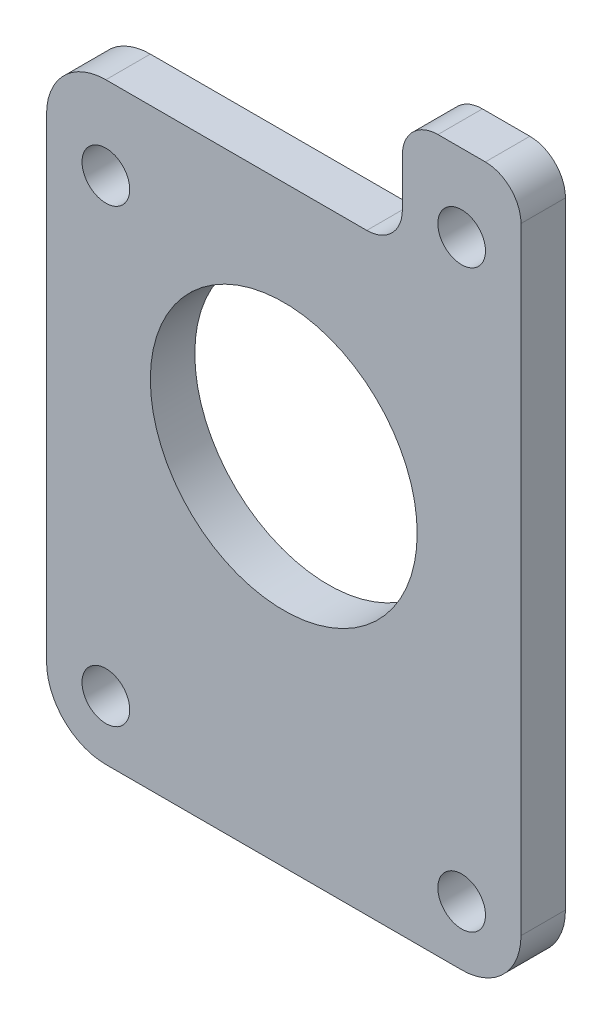
ISO-10303-21;
HEADER;
FILE_DESCRIPTION(('STEP AP214'),'2;1');
FILE_NAME('part.step','',(''),(''),'','','');
FILE_SCHEMA(('AUTOMOTIVE_DESIGN { 1 0 10303 214 1 1 1 1 }'));
ENDSEC;
DATA;
#1=APPLICATION_CONTEXT('core data for automotive mechanical design processes');
#2=APPLICATION_PROTOCOL_DEFINITION('international standard','automotive_design',2000,#1);
#3=PRODUCT_CONTEXT('',#1,'mechanical');
#4=PRODUCT('Part','Part','',(#3));
#5=PRODUCT_RELATED_PRODUCT_CATEGORY('part','',(#4));
#6=PRODUCT_DEFINITION_FORMATION('','',#4);
#7=PRODUCT_DEFINITION_CONTEXT('part definition',#1,'design');
#8=PRODUCT_DEFINITION('design','',#6,#7);
#9=PRODUCT_DEFINITION_SHAPE('','',#8);
#10=(LENGTH_UNIT() NAMED_UNIT(*) SI_UNIT(.MILLI.,.METRE.));
#11=(NAMED_UNIT(*) PLANE_ANGLE_UNIT() SI_UNIT($,.RADIAN.));
#12=(NAMED_UNIT(*) SI_UNIT($,.STERADIAN.) SOLID_ANGLE_UNIT());
#13=UNCERTAINTY_MEASURE_WITH_UNIT(LENGTH_MEASURE(1.E-05),#10,'distance_accuracy_value','');
#14=(GEOMETRIC_REPRESENTATION_CONTEXT(3) GLOBAL_UNCERTAINTY_ASSIGNED_CONTEXT((#13)) GLOBAL_UNIT_ASSIGNED_CONTEXT((#10,
#11,#12)) REPRESENTATION_CONTEXT('',''));
#15=CARTESIAN_POINT('',(0.,0.,0.));
#16=DIRECTION('',(0.,0.,1.));
#17=DIRECTION('',(1.,0.,0.));
#18=AXIS2_PLACEMENT_3D('',#15,#16,#17);
#19=CARTESIAN_POINT('',(50.8,0.,4.7625));
#20=DIRECTION('',(1.,0.,0.));
#21=DIRECTION('',(0.,0.,-1.));
#22=AXIS2_PLACEMENT_3D('',#19,#20,#21);
#23=PLANE('',#22);
#24=DIRECTION('',(0.,-1.,0.));
#25=VECTOR('',#24,1.);
#26=CARTESIAN_POINT('',(50.8,0.,0.));
#27=LINE('',#26,#25);
#28=CARTESIAN_POINT('',(50.8,72.39,0.));
#29=VERTEX_POINT('',#28);
#30=CARTESIAN_POINT('',(50.8,6.35,0.));
#31=VERTEX_POINT('',#30);
#32=EDGE_CURVE('E125',#29,#31,#27,.T.);
#33=ORIENTED_EDGE('',*,*,#32,.F.);
#34=DIRECTION('',(0.,0.,-1.));
#35=VECTOR('',#34,1.);
#36=CARTESIAN_POINT('',(50.8,72.39,4.7625));
#37=LINE('',#36,#35);
#38=CARTESIAN_POINT('',(50.8,72.39,4.7625));
#39=VERTEX_POINT('',#38);
#40=EDGE_CURVE('E189',#29,#39,#37,.F.);
#41=ORIENTED_EDGE('',*,*,#40,.T.);
#42=DIRECTION('',(0.,-1.,0.));
#43=VECTOR('',#42,1.);
#44=CARTESIAN_POINT('',(50.8,0.,4.7625));
#45=LINE('',#44,#43);
#46=CARTESIAN_POINT('',(50.8,6.35,4.7625));
#47=VERTEX_POINT('',#46);
#48=EDGE_CURVE('E151',#39,#47,#45,.T.);
#49=ORIENTED_EDGE('',*,*,#48,.T.);
#50=DIRECTION('',(0.,0.,-1.));
#51=VECTOR('',#50,1.);
#52=CARTESIAN_POINT('',(50.8,6.35,0.));
#53=LINE('',#52,#51);
#54=EDGE_CURVE('E145',#47,#31,#53,.T.);
#55=ORIENTED_EDGE('',*,*,#54,.T.);
#56=EDGE_LOOP('',(#33,#41,#49,#55));
#57=FACE_BOUND('',#56,.T.);
#58=ADVANCED_FACE('F37',(#57),#23,.T.);
#59=CARTESIAN_POINT('',(0.,76.2,4.7625));
#60=DIRECTION('',(0.,-1.,0.));
#61=DIRECTION('',(0.,0.,-1.));
#62=AXIS2_PLACEMENT_3D('',#59,#60,#61);
#63=PLANE('',#62);
#64=DIRECTION('',(-1.,0.,0.));
#65=VECTOR('',#64,1.);
#66=CARTESIAN_POINT('',(0.,76.2,4.7625));
#67=LINE('',#66,#65);
#68=CARTESIAN_POINT('',(46.99,76.2,4.7625));
#69=VERTEX_POINT('',#68);
#70=CARTESIAN_POINT('',(41.91,76.2,4.7625));
#71=VERTEX_POINT('',#70);
#72=EDGE_CURVE('E224',#69,#71,#67,.T.);
#73=ORIENTED_EDGE('',*,*,#72,.F.);
#74=DIRECTION('',(0.,0.,-1.));
#75=VECTOR('',#74,1.);
#76=CARTESIAN_POINT('',(46.99,76.2,0.));
#77=LINE('',#76,#75);
#78=CARTESIAN_POINT('',(46.99,76.2,0.));
#79=VERTEX_POINT('',#78);
#80=EDGE_CURVE('E183',#69,#79,#77,.T.);
#81=ORIENTED_EDGE('',*,*,#80,.T.);
#82=DIRECTION('',(-1.,0.,0.));
#83=VECTOR('',#82,1.);
#84=CARTESIAN_POINT('',(0.,76.2,0.));
#85=LINE('',#84,#83);
#86=CARTESIAN_POINT('',(41.91,76.2,0.));
#87=VERTEX_POINT('',#86);
#88=EDGE_CURVE('E137',#79,#87,#85,.T.);
#89=ORIENTED_EDGE('',*,*,#88,.T.);
#90=DIRECTION('',(0.,0.,-1.));
#91=VECTOR('',#90,1.);
#92=CARTESIAN_POINT('',(41.91,76.2,4.7625));
#93=LINE('',#92,#91);
#94=EDGE_CURVE('E181',#87,#71,#93,.F.);
#95=ORIENTED_EDGE('',*,*,#94,.T.);
#96=EDGE_LOOP('',(#73,#81,#89,#95));
#97=FACE_BOUND('',#96,.T.);
#98=ADVANCED_FACE('F274',(#97),#63,.F.);
#99=CARTESIAN_POINT('',(38.1,0.,4.7625));
#100=DIRECTION('',(-1.,0.,0.));
#101=DIRECTION('',(0.,0.,1.));
#102=AXIS2_PLACEMENT_3D('',#99,#100,#101);
#103=PLANE('',#102);
#104=DIRECTION('',(0.,1.,0.));
#105=VECTOR('',#104,1.);
#106=CARTESIAN_POINT('',(38.1,0.,4.7625));
#107=LINE('',#106,#105);
#108=CARTESIAN_POINT('',(38.1,67.31,4.7625));
#109=VERTEX_POINT('',#108);
#110=CARTESIAN_POINT('',(38.1,72.39,4.7625));
#111=VERTEX_POINT('',#110);
#112=EDGE_CURVE('E220',#109,#111,#107,.T.);
#113=ORIENTED_EDGE('',*,*,#112,.T.);
#114=DIRECTION('',(0.,0.,-1.));
#115=VECTOR('',#114,1.);
#116=CARTESIAN_POINT('',(38.1,72.39,0.));
#117=LINE('',#116,#115);
#118=CARTESIAN_POINT('',(38.1,72.39,0.));
#119=VERTEX_POINT('',#118);
#120=EDGE_CURVE('E196',#111,#119,#117,.T.);
#121=ORIENTED_EDGE('',*,*,#120,.T.);
#122=DIRECTION('',(0.,1.,0.));
#123=VECTOR('',#122,1.);
#124=CARTESIAN_POINT('',(38.1,0.,0.));
#125=LINE('',#124,#123);
#126=CARTESIAN_POINT('',(38.1,67.31,0.));
#127=VERTEX_POINT('',#126);
#128=EDGE_CURVE('E204',#127,#119,#125,.T.);
#129=ORIENTED_EDGE('',*,*,#128,.F.);
#130=DIRECTION('',(0.,0.,-1.));
#131=VECTOR('',#130,1.);
#132=CARTESIAN_POINT('',(38.1,67.31,4.7625));
#133=LINE('',#132,#131);
#134=EDGE_CURVE('E194',#127,#109,#133,.F.);
#135=ORIENTED_EDGE('',*,*,#134,.T.);
#136=EDGE_LOOP('',(#113,#121,#129,#135));
#137=FACE_BOUND('',#136,.T.);
#138=ADVANCED_FACE('F211',(#137),#103,.T.);
#139=CARTESIAN_POINT('',(0.,63.5,4.7625));
#140=DIRECTION('',(0.,1.,0.));
#141=DIRECTION('',(0.,0.,1.));
#142=AXIS2_PLACEMENT_3D('',#139,#140,#141);
#143=PLANE('',#142);
#144=DIRECTION('',(1.,0.,0.));
#145=VECTOR('',#144,1.);
#146=CARTESIAN_POINT('',(0.,63.5,4.7625));
#147=LINE('',#146,#145);
#148=CARTESIAN_POINT('',(6.34999999999999,63.5,4.7625));
#149=VERTEX_POINT('',#148);
#150=CARTESIAN_POINT('',(34.29,63.5,4.7625));
#151=VERTEX_POINT('',#150);
#152=EDGE_CURVE('E217',#149,#151,#147,.T.);
#153=ORIENTED_EDGE('',*,*,#152,.T.);
#154=DIRECTION('',(0.,0.,-1.));
#155=VECTOR('',#154,1.);
#156=CARTESIAN_POINT('',(34.29,63.5,0.));
#157=LINE('',#156,#155);
#158=CARTESIAN_POINT('',(34.29,63.5,0.));
#159=VERTEX_POINT('',#158);
#160=EDGE_CURVE('E199',#151,#159,#157,.T.);
#161=ORIENTED_EDGE('',*,*,#160,.T.);
#162=DIRECTION('',(1.,0.,0.));
#163=VECTOR('',#162,1.);
#164=CARTESIAN_POINT('',(0.,63.5,0.));
#165=LINE('',#164,#163);
#166=CARTESIAN_POINT('',(6.34999999999999,63.5,0.));
#167=VERTEX_POINT('',#166);
#168=EDGE_CURVE('E206',#167,#159,#165,.T.);
#169=ORIENTED_EDGE('',*,*,#168,.F.);
#170=DIRECTION('',(0.,0.,-1.));
#171=VECTOR('',#170,1.);
#172=CARTESIAN_POINT('',(6.34999999999999,63.5,4.7625));
#173=LINE('',#172,#171);
#174=EDGE_CURVE('E179',#167,#149,#173,.F.);
#175=ORIENTED_EDGE('',*,*,#174,.T.);
#176=EDGE_LOOP('',(#153,#161,#169,#175));
#177=FACE_BOUND('',#176,.T.);
#178=ADVANCED_FACE('F215',(#177),#143,.T.);
#179=CARTESIAN_POINT('',(0.,0.,4.7625));
#180=DIRECTION('',(1.,0.,0.));
#181=DIRECTION('',(0.,1.,0.));
#182=AXIS2_PLACEMENT_3D('',#179,#180,#181);
#183=PLANE('',#182);
#184=DIRECTION('',(0.,-1.,0.));
#185=VECTOR('',#184,1.);
#186=CARTESIAN_POINT('',(0.,0.,0.));
#187=LINE('',#186,#185);
#188=CARTESIAN_POINT('',(0.,57.15,0.));
#189=VERTEX_POINT('',#188);
#190=CARTESIAN_POINT('',(0.,6.35,0.));
#191=VERTEX_POINT('',#190);
#192=EDGE_CURVE('E244',#189,#191,#187,.T.);
#193=ORIENTED_EDGE('',*,*,#192,.T.);
#194=DIRECTION('',(0.,0.,-1.));
#195=VECTOR('',#194,1.);
#196=CARTESIAN_POINT('',(0.,6.35,4.7625));
#197=LINE('',#196,#195);
#198=CARTESIAN_POINT('',(0.,6.35,4.7625));
#199=VERTEX_POINT('',#198);
#200=EDGE_CURVE('E177',#191,#199,#197,.F.);
#201=ORIENTED_EDGE('',*,*,#200,.T.);
#202=DIRECTION('',(0.,-1.,0.));
#203=VECTOR('',#202,1.);
#204=CARTESIAN_POINT('',(0.,0.,4.7625));
#205=LINE('',#204,#203);
#206=CARTESIAN_POINT('',(0.,57.15,4.7625));
#207=VERTEX_POINT('',#206);
#208=EDGE_CURVE('E219',#207,#199,#205,.T.);
#209=ORIENTED_EDGE('',*,*,#208,.F.);
#210=DIRECTION('',(0.,0.,-1.));
#211=VECTOR('',#210,1.);
#212=CARTESIAN_POINT('',(0.,57.15,0.));
#213=LINE('',#212,#211);
#214=EDGE_CURVE('E174',#207,#189,#213,.T.);
#215=ORIENTED_EDGE('',*,*,#214,.T.);
#216=EDGE_LOOP('',(#193,#201,#209,#215));
#217=FACE_BOUND('',#216,.T.);
#218=ADVANCED_FACE('F286',(#217),#183,.F.);
#219=CARTESIAN_POINT('',(0.,0.,4.7625));
#220=DIRECTION('',(0.,1.,0.));
#221=DIRECTION('',(0.,0.,1.));
#222=AXIS2_PLACEMENT_3D('',#219,#220,#221);
#223=PLANE('',#222);
#224=DIRECTION('',(1.,0.,0.));
#225=VECTOR('',#224,1.);
#226=CARTESIAN_POINT('',(0.,0.,0.));
#227=LINE('',#226,#225);
#228=CARTESIAN_POINT('',(6.35,0.,0.));
#229=VERTEX_POINT('',#228);
#230=CARTESIAN_POINT('',(44.45,0.,0.));
#231=VERTEX_POINT('',#230);
#232=EDGE_CURVE('E246',#229,#231,#227,.T.);
#233=ORIENTED_EDGE('',*,*,#232,.T.);
#234=DIRECTION('',(0.,0.,-1.));
#235=VECTOR('',#234,1.);
#236=CARTESIAN_POINT('',(44.45,0.,4.7625));
#237=LINE('',#236,#235);
#238=CARTESIAN_POINT('',(44.45,0.,4.7625));
#239=VERTEX_POINT('',#238);
#240=EDGE_CURVE('E146',#231,#239,#237,.F.);
#241=ORIENTED_EDGE('',*,*,#240,.T.);
#242=DIRECTION('',(1.,0.,0.));
#243=VECTOR('',#242,1.);
#244=CARTESIAN_POINT('',(0.,0.,4.7625));
#245=LINE('',#244,#243);
#246=CARTESIAN_POINT('',(6.35,0.,4.7625));
#247=VERTEX_POINT('',#246);
#248=EDGE_CURVE('E158',#247,#239,#245,.T.);
#249=ORIENTED_EDGE('',*,*,#248,.F.);
#250=DIRECTION('',(0.,0.,-1.));
#251=VECTOR('',#250,1.);
#252=CARTESIAN_POINT('',(6.35,0.,4.7625));
#253=LINE('',#252,#251);
#254=EDGE_CURVE('E147',#247,#229,#253,.T.);
#255=ORIENTED_EDGE('',*,*,#254,.T.);
#256=EDGE_LOOP('',(#233,#241,#249,#255));
#257=FACE_BOUND('',#256,.T.);
#258=ADVANCED_FACE('F280',(#257),#223,.F.);
#259=CARTESIAN_POINT('',(6.35,6.35000000000001,4.7625));
#260=DIRECTION('',(0.,0.,-1.));
#261=DIRECTION('',(-1.,0.,0.));
#262=AXIS2_PLACEMENT_3D('',#259,#260,#261);
#263=CYLINDRICAL_SURFACE('',#262,2.5527);
#264=CARTESIAN_POINT('',(6.35,6.35000000000001,4.7625));
#265=DIRECTION('',(0.,0.,1.));
#266=DIRECTION('',(1.,0.,0.));
#267=AXIS2_PLACEMENT_3D('',#264,#265,#266);
#268=CIRCLE('',#267,2.5527);
#269=CARTESIAN_POINT('',(3.7973,6.35000000000001,4.7625));
#270=VERTEX_POINT('',#269);
#271=EDGE_CURVE('E262',#270,#270,#268,.T.);
#272=CARTESIAN_POINT('',(6.35,6.35000000000001,0.));
#273=DIRECTION('',(0.,0.,1.));
#274=DIRECTION('',(1.,0.,0.));
#275=AXIS2_PLACEMENT_3D('',#272,#273,#274);
#276=CIRCLE('',#275,2.5527);
#277=CARTESIAN_POINT('',(3.7973,6.35000000000001,0.));
#278=VERTEX_POINT('',#277);
#279=EDGE_CURVE('E138',#278,#278,#276,.T.);
#280=CARTESIAN_POINT('',(3.7973,6.35000000000001,4.7625));
#281=CARTESIAN_POINT('',(3.7973,6.35000000000001,4.712890625));
#282=CARTESIAN_POINT('',(3.7973,6.35000000000001,4.66328125));
#283=CARTESIAN_POINT('',(3.7973,6.35000000000001,4.5640625));
#284=CARTESIAN_POINT('',(3.7973,6.35000000000001,4.514453125));
#285=CARTESIAN_POINT('',(3.7973,6.35000000000001,4.415234375));
#286=CARTESIAN_POINT('',(3.7973,6.35000000000001,4.365625));
#287=CARTESIAN_POINT('',(3.7973,6.35000000000001,4.26640625));
#288=CARTESIAN_POINT('',(3.7973,6.35000000000001,4.216796875));
#289=CARTESIAN_POINT('',(3.7973,6.35000000000001,4.117578125));
#290=CARTESIAN_POINT('',(3.7973,6.35000000000001,4.06796875));
#291=CARTESIAN_POINT('',(3.7973,6.35000000000001,3.96875));
#292=CARTESIAN_POINT('',(3.7973,6.35000000000001,3.919140625));
#293=CARTESIAN_POINT('',(3.7973,6.35000000000001,3.819921875));
#294=CARTESIAN_POINT('',(3.7973,6.35000000000001,3.7703125));
#295=CARTESIAN_POINT('',(3.7973,6.35000000000001,3.67109375));
#296=CARTESIAN_POINT('',(3.7973,6.35000000000001,3.621484375));
#297=CARTESIAN_POINT('',(3.7973,6.35000000000001,3.522265625));
#298=CARTESIAN_POINT('',(3.7973,6.35000000000001,3.47265625));
#299=CARTESIAN_POINT('',(3.7973,6.35000000000001,3.3734375));
#300=CARTESIAN_POINT('',(3.7973,6.35000000000001,3.323828125));
#301=CARTESIAN_POINT('',(3.7973,6.35000000000001,3.224609375));
#302=CARTESIAN_POINT('',(3.7973,6.35000000000001,3.175));
#303=CARTESIAN_POINT('',(3.7973,6.35000000000001,3.07578125));
#304=CARTESIAN_POINT('',(3.7973,6.35000000000001,3.026171875));
#305=CARTESIAN_POINT('',(3.7973,6.35000000000001,2.926953125));
#306=CARTESIAN_POINT('',(3.7973,6.35000000000001,2.87734375));
#307=CARTESIAN_POINT('',(3.7973,6.35000000000001,2.778125));
#308=CARTESIAN_POINT('',(3.7973,6.35000000000001,2.728515625));
#309=CARTESIAN_POINT('',(3.7973,6.35000000000001,2.629296875));
#310=CARTESIAN_POINT('',(3.7973,6.35000000000001,2.5796875));
#311=CARTESIAN_POINT('',(3.7973,6.35000000000001,2.48046875));
#312=CARTESIAN_POINT('',(3.7973,6.35000000000001,2.430859375));
#313=CARTESIAN_POINT('',(3.7973,6.35000000000001,2.331640625));
#314=CARTESIAN_POINT('',(3.7973,6.35000000000001,2.28203125));
#315=CARTESIAN_POINT('',(3.7973,6.35000000000001,2.1828125));
#316=CARTESIAN_POINT('',(3.7973,6.35000000000001,2.133203125));
#317=CARTESIAN_POINT('',(3.7973,6.35000000000001,2.033984375));
#318=CARTESIAN_POINT('',(3.7973,6.35000000000001,1.984375));
#319=CARTESIAN_POINT('',(3.7973,6.35000000000001,1.88515625));
#320=CARTESIAN_POINT('',(3.7973,6.35000000000001,1.835546875));
#321=CARTESIAN_POINT('',(3.7973,6.35000000000001,1.736328125));
#322=CARTESIAN_POINT('',(3.7973,6.35000000000001,1.68671875));
#323=CARTESIAN_POINT('',(3.7973,6.35000000000001,1.5875));
#324=CARTESIAN_POINT('',(3.7973,6.35000000000001,1.537890625));
#325=CARTESIAN_POINT('',(3.7973,6.35000000000001,1.438671875));
#326=CARTESIAN_POINT('',(3.7973,6.35000000000001,1.3890625));
#327=CARTESIAN_POINT('',(3.7973,6.35000000000001,1.28984375));
#328=CARTESIAN_POINT('',(3.7973,6.35000000000001,1.240234375));
#329=CARTESIAN_POINT('',(3.7973,6.35000000000001,1.141015625));
#330=CARTESIAN_POINT('',(3.7973,6.35000000000001,1.09140625));
#331=CARTESIAN_POINT('',(3.7973,6.35000000000001,0.992187499999999));
#332=CARTESIAN_POINT('',(3.7973,6.35000000000001,0.942578124999999));
#333=CARTESIAN_POINT('',(3.7973,6.35000000000001,0.843359375));
#334=CARTESIAN_POINT('',(3.7973,6.35000000000001,0.79375));
#335=CARTESIAN_POINT('',(3.7973,6.35000000000001,0.69453125));
#336=CARTESIAN_POINT('',(3.7973,6.35000000000001,0.644921875));
#337=CARTESIAN_POINT('',(3.7973,6.35000000000001,0.545703125));
#338=CARTESIAN_POINT('',(3.7973,6.35000000000001,0.49609375));
#339=CARTESIAN_POINT('',(3.7973,6.35000000000001,0.396875));
#340=CARTESIAN_POINT('',(3.7973,6.35000000000001,0.347265625));
#341=CARTESIAN_POINT('',(3.7973,6.35000000000001,0.248046875));
#342=CARTESIAN_POINT('',(3.7973,6.35000000000001,0.1984375));
#343=CARTESIAN_POINT('',(3.7973,6.35000000000001,0.09921875));
#344=CARTESIAN_POINT('',(3.7973,6.35000000000001,0.049609375));
#345=CARTESIAN_POINT('',(3.7973,6.35000000000001,0.));
#346=B_SPLINE_CURVE_WITH_KNOTS('',3,(#280,#281,#282,#283,#284,#285,#286,#287,#288,#289,#290,
#291,#292,#293,#294,#295,#296,#297,#298,#299,#300,#301,#302,#303,#304,#305,#306,#307,#308,#309,
#310,#311,#312,#313,#314,#315,#316,#317,#318,#319,#320,#321,#322,#323,#324,#325,#326,#327,#328,
#329,#330,#331,#332,#333,#334,#335,#336,#337,#338,#339,#340,#341,#342,#343,#344,#345),
.UNSPECIFIED.,.F.,.F.,(4,2,2,2,2,2,2,2,2,2,2,2,2,2,2,2,2,2,2,2,2,2,2,2,2,2,2,2,2,2,2,2,4),(0.,
0.148828125,0.29765625,0.446484375,0.5953125,0.744140625,0.892968750000001,1.041796875,1.190625,
1.339453125,1.48828125,1.637109375,1.7859375,1.934765625,2.08359375,2.232421875,2.38125,
2.530078125,2.67890625,2.827734375,2.9765625,3.125390625,3.27421875,3.423046875,3.571875,
3.720703125,3.86953125,4.018359375,4.1671875,4.316015625,4.46484375,4.613671875,4.7625),.UNSPECIFIED.);
#347=EDGE_CURVE('BSEAM307',#270,#278,#346,.T.);
#348=ORIENTED_EDGE('',*,*,#271,.T.);
#349=ORIENTED_EDGE('',*,*,#279,.F.);
#350=ORIENTED_EDGE('',*,*,#347,.T.);
#351=ORIENTED_EDGE('',*,*,#347,.F.);
#352=EDGE_LOOP('',(#348,#350,#349,#351));
#353=FACE_BOUND('',#352,.T.);
#354=ADVANCED_FACE('F307',(#353),#263,.F.);
#355=CARTESIAN_POINT('',(44.45,6.35000000000002,4.7625));
#356=DIRECTION('',(0.,0.,-1.));
#357=DIRECTION('',(-1.,0.,0.));
#358=AXIS2_PLACEMENT_3D('',#355,#356,#357);
#359=CYLINDRICAL_SURFACE('',#358,2.5527);
#360=CARTESIAN_POINT('',(44.45,6.35000000000002,4.7625));
#361=DIRECTION('',(0.,0.,1.));
#362=DIRECTION('',(1.,0.,0.));
#363=AXIS2_PLACEMENT_3D('',#360,#361,#362);
#364=CIRCLE('',#363,2.5527);
#365=CARTESIAN_POINT('',(41.8973,6.35000000000002,4.7625));
#366=VERTEX_POINT('',#365);
#367=EDGE_CURVE('E257',#366,#366,#364,.T.);
#368=CARTESIAN_POINT('',(44.45,6.35000000000002,0.));
#369=DIRECTION('',(0.,0.,1.));
#370=DIRECTION('',(1.,0.,0.));
#371=AXIS2_PLACEMENT_3D('',#368,#369,#370);
#372=CIRCLE('',#371,2.5527);
#373=CARTESIAN_POINT('',(41.8973,6.35000000000002,0.));
#374=VERTEX_POINT('',#373);
#375=EDGE_CURVE('E236',#374,#374,#372,.T.);
#376=CARTESIAN_POINT('',(41.8973,6.35000000000002,4.7625));
#377=CARTESIAN_POINT('',(41.8973,6.35000000000002,4.712890625));
#378=CARTESIAN_POINT('',(41.8973,6.35000000000002,4.66328125));
#379=CARTESIAN_POINT('',(41.8973,6.35000000000002,4.5640625));
#380=CARTESIAN_POINT('',(41.8973,6.35000000000002,4.514453125));
#381=CARTESIAN_POINT('',(41.8973,6.35000000000002,4.415234375));
#382=CARTESIAN_POINT('',(41.8973,6.35000000000002,4.365625));
#383=CARTESIAN_POINT('',(41.8973,6.35000000000002,4.26640625));
#384=CARTESIAN_POINT('',(41.8973,6.35000000000002,4.216796875));
#385=CARTESIAN_POINT('',(41.8973,6.35000000000002,4.117578125));
#386=CARTESIAN_POINT('',(41.8973,6.35000000000002,4.06796875));
#387=CARTESIAN_POINT('',(41.8973,6.35000000000002,3.96875));
#388=CARTESIAN_POINT('',(41.8973,6.35000000000002,3.919140625));
#389=CARTESIAN_POINT('',(41.8973,6.35000000000002,3.819921875));
#390=CARTESIAN_POINT('',(41.8973,6.35000000000002,3.7703125));
#391=CARTESIAN_POINT('',(41.8973,6.35000000000002,3.67109375));
#392=CARTESIAN_POINT('',(41.8973,6.35000000000002,3.621484375));
#393=CARTESIAN_POINT('',(41.8973,6.35000000000002,3.522265625));
#394=CARTESIAN_POINT('',(41.8973,6.35000000000002,3.47265625));
#395=CARTESIAN_POINT('',(41.8973,6.35000000000002,3.3734375));
#396=CARTESIAN_POINT('',(41.8973,6.35000000000002,3.323828125));
#397=CARTESIAN_POINT('',(41.8973,6.35000000000002,3.224609375));
#398=CARTESIAN_POINT('',(41.8973,6.35000000000002,3.175));
#399=CARTESIAN_POINT('',(41.8973,6.35000000000002,3.07578125));
#400=CARTESIAN_POINT('',(41.8973,6.35000000000002,3.026171875));
#401=CARTESIAN_POINT('',(41.8973,6.35000000000002,2.926953125));
#402=CARTESIAN_POINT('',(41.8973,6.35000000000002,2.87734375));
#403=CARTESIAN_POINT('',(41.8973,6.35000000000002,2.778125));
#404=CARTESIAN_POINT('',(41.8973,6.35000000000002,2.728515625));
#405=CARTESIAN_POINT('',(41.8973,6.35000000000002,2.629296875));
#406=CARTESIAN_POINT('',(41.8973,6.35000000000002,2.5796875));
#407=CARTESIAN_POINT('',(41.8973,6.35000000000002,2.48046875));
#408=CARTESIAN_POINT('',(41.8973,6.35000000000002,2.430859375));
#409=CARTESIAN_POINT('',(41.8973,6.35000000000002,2.331640625));
#410=CARTESIAN_POINT('',(41.8973,6.35000000000002,2.28203125));
#411=CARTESIAN_POINT('',(41.8973,6.35000000000002,2.1828125));
#412=CARTESIAN_POINT('',(41.8973,6.35000000000002,2.133203125));
#413=CARTESIAN_POINT('',(41.8973,6.35000000000002,2.033984375));
#414=CARTESIAN_POINT('',(41.8973,6.35000000000002,1.984375));
#415=CARTESIAN_POINT('',(41.8973,6.35000000000002,1.88515625));
#416=CARTESIAN_POINT('',(41.8973,6.35000000000002,1.835546875));
#417=CARTESIAN_POINT('',(41.8973,6.35000000000002,1.736328125));
#418=CARTESIAN_POINT('',(41.8973,6.35000000000002,1.68671875));
#419=CARTESIAN_POINT('',(41.8973,6.35000000000002,1.5875));
#420=CARTESIAN_POINT('',(41.8973,6.35000000000002,1.537890625));
#421=CARTESIAN_POINT('',(41.8973,6.35000000000002,1.438671875));
#422=CARTESIAN_POINT('',(41.8973,6.35000000000002,1.3890625));
#423=CARTESIAN_POINT('',(41.8973,6.35000000000002,1.28984375));
#424=CARTESIAN_POINT('',(41.8973,6.35000000000002,1.240234375));
#425=CARTESIAN_POINT('',(41.8973,6.35000000000002,1.141015625));
#426=CARTESIAN_POINT('',(41.8973,6.35000000000002,1.09140625));
#427=CARTESIAN_POINT('',(41.8973,6.35000000000002,0.992187499999999));
#428=CARTESIAN_POINT('',(41.8973,6.35000000000002,0.942578124999999));
#429=CARTESIAN_POINT('',(41.8973,6.35000000000002,0.843359375));
#430=CARTESIAN_POINT('',(41.8973,6.35000000000002,0.79375));
#431=CARTESIAN_POINT('',(41.8973,6.35000000000002,0.69453125));
#432=CARTESIAN_POINT('',(41.8973,6.35000000000002,0.644921875));
#433=CARTESIAN_POINT('',(41.8973,6.35000000000002,0.545703125));
#434=CARTESIAN_POINT('',(41.8973,6.35000000000002,0.49609375));
#435=CARTESIAN_POINT('',(41.8973,6.35000000000002,0.396875));
#436=CARTESIAN_POINT('',(41.8973,6.35000000000002,0.347265625));
#437=CARTESIAN_POINT('',(41.8973,6.35000000000002,0.248046875));
#438=CARTESIAN_POINT('',(41.8973,6.35000000000002,0.1984375));
#439=CARTESIAN_POINT('',(41.8973,6.35000000000002,0.09921875));
#440=CARTESIAN_POINT('',(41.8973,6.35000000000002,0.049609375));
#441=CARTESIAN_POINT('',(41.8973,6.35000000000002,0.));
#442=B_SPLINE_CURVE_WITH_KNOTS('',3,(#376,#377,#378,#379,#380,#381,#382,#383,#384,#385,#386,
#387,#388,#389,#390,#391,#392,#393,#394,#395,#396,#397,#398,#399,#400,#401,#402,#403,#404,#405,
#406,#407,#408,#409,#410,#411,#412,#413,#414,#415,#416,#417,#418,#419,#420,#421,#422,#423,#424,
#425,#426,#427,#428,#429,#430,#431,#432,#433,#434,#435,#436,#437,#438,#439,#440,#441),
.UNSPECIFIED.,.F.,.F.,(4,2,2,2,2,2,2,2,2,2,2,2,2,2,2,2,2,2,2,2,2,2,2,2,2,2,2,2,2,2,2,2,4),(0.,
0.148828125,0.29765625,0.446484375,0.5953125,0.744140625,0.892968750000001,1.041796875,1.190625,
1.339453125,1.48828125,1.637109375,1.7859375,1.934765625,2.08359375,2.232421875,2.38125,
2.530078125,2.67890625,2.827734375,2.9765625,3.125390625,3.27421875,3.423046875,3.571875,
3.720703125,3.86953125,4.018359375,4.1671875,4.316015625,4.46484375,4.613671875,4.7625),.UNSPECIFIED.);
#443=EDGE_CURVE('BSEAM310',#366,#374,#442,.T.);
#444=ORIENTED_EDGE('',*,*,#367,.T.);
#445=ORIENTED_EDGE('',*,*,#375,.F.);
#446=ORIENTED_EDGE('',*,*,#443,.T.);
#447=ORIENTED_EDGE('',*,*,#443,.F.);
#448=EDGE_LOOP('',(#444,#446,#445,#447));
#449=FACE_BOUND('',#448,.T.);
#450=ADVANCED_FACE('F310',(#449),#359,.F.);
#451=CARTESIAN_POINT('',(6.35,54.61,4.7625));
#452=DIRECTION('',(0.,0.,-1.));
#453=DIRECTION('',(-1.,0.,0.));
#454=AXIS2_PLACEMENT_3D('',#451,#452,#453);
#455=CYLINDRICAL_SURFACE('',#454,2.5527);
#456=CARTESIAN_POINT('',(6.35,54.61,4.7625));
#457=DIRECTION('',(0.,0.,1.));
#458=DIRECTION('',(1.,0.,0.));
#459=AXIS2_PLACEMENT_3D('',#456,#457,#458);
#460=CIRCLE('',#459,2.5527);
#461=CARTESIAN_POINT('',(3.7973,54.61,4.7625));
#462=VERTEX_POINT('',#461);
#463=EDGE_CURVE('E252',#462,#462,#460,.T.);
#464=CARTESIAN_POINT('',(6.35,54.61,0.));
#465=DIRECTION('',(0.,0.,1.));
#466=DIRECTION('',(1.,0.,0.));
#467=AXIS2_PLACEMENT_3D('',#464,#465,#466);
#468=CIRCLE('',#467,2.5527);
#469=CARTESIAN_POINT('',(3.7973,54.61,0.));
#470=VERTEX_POINT('',#469);
#471=EDGE_CURVE('E233',#470,#470,#468,.T.);
#472=CARTESIAN_POINT('',(3.7973,54.61,4.7625));
#473=CARTESIAN_POINT('',(3.7973,54.61,4.712890625));
#474=CARTESIAN_POINT('',(3.7973,54.61,4.66328125));
#475=CARTESIAN_POINT('',(3.7973,54.61,4.5640625));
#476=CARTESIAN_POINT('',(3.7973,54.61,4.514453125));
#477=CARTESIAN_POINT('',(3.7973,54.61,4.415234375));
#478=CARTESIAN_POINT('',(3.7973,54.61,4.365625));
#479=CARTESIAN_POINT('',(3.7973,54.61,4.26640625));
#480=CARTESIAN_POINT('',(3.7973,54.61,4.216796875));
#481=CARTESIAN_POINT('',(3.7973,54.61,4.117578125));
#482=CARTESIAN_POINT('',(3.7973,54.61,4.06796875));
#483=CARTESIAN_POINT('',(3.7973,54.61,3.96875));
#484=CARTESIAN_POINT('',(3.7973,54.61,3.919140625));
#485=CARTESIAN_POINT('',(3.7973,54.61,3.819921875));
#486=CARTESIAN_POINT('',(3.7973,54.61,3.7703125));
#487=CARTESIAN_POINT('',(3.7973,54.61,3.67109375));
#488=CARTESIAN_POINT('',(3.7973,54.61,3.621484375));
#489=CARTESIAN_POINT('',(3.7973,54.61,3.522265625));
#490=CARTESIAN_POINT('',(3.7973,54.61,3.47265625));
#491=CARTESIAN_POINT('',(3.7973,54.61,3.3734375));
#492=CARTESIAN_POINT('',(3.7973,54.61,3.323828125));
#493=CARTESIAN_POINT('',(3.7973,54.61,3.224609375));
#494=CARTESIAN_POINT('',(3.7973,54.61,3.175));
#495=CARTESIAN_POINT('',(3.7973,54.61,3.07578125));
#496=CARTESIAN_POINT('',(3.7973,54.61,3.026171875));
#497=CARTESIAN_POINT('',(3.7973,54.61,2.926953125));
#498=CARTESIAN_POINT('',(3.7973,54.61,2.87734375));
#499=CARTESIAN_POINT('',(3.7973,54.61,2.778125));
#500=CARTESIAN_POINT('',(3.7973,54.61,2.728515625));
#501=CARTESIAN_POINT('',(3.7973,54.61,2.629296875));
#502=CARTESIAN_POINT('',(3.7973,54.61,2.5796875));
#503=CARTESIAN_POINT('',(3.7973,54.61,2.48046875));
#504=CARTESIAN_POINT('',(3.7973,54.61,2.430859375));
#505=CARTESIAN_POINT('',(3.7973,54.61,2.331640625));
#506=CARTESIAN_POINT('',(3.7973,54.61,2.28203125));
#507=CARTESIAN_POINT('',(3.7973,54.61,2.1828125));
#508=CARTESIAN_POINT('',(3.7973,54.61,2.133203125));
#509=CARTESIAN_POINT('',(3.7973,54.61,2.033984375));
#510=CARTESIAN_POINT('',(3.7973,54.61,1.984375));
#511=CARTESIAN_POINT('',(3.7973,54.61,1.88515625));
#512=CARTESIAN_POINT('',(3.7973,54.61,1.835546875));
#513=CARTESIAN_POINT('',(3.7973,54.61,1.736328125));
#514=CARTESIAN_POINT('',(3.7973,54.61,1.68671875));
#515=CARTESIAN_POINT('',(3.7973,54.61,1.5875));
#516=CARTESIAN_POINT('',(3.7973,54.61,1.537890625));
#517=CARTESIAN_POINT('',(3.7973,54.61,1.438671875));
#518=CARTESIAN_POINT('',(3.7973,54.61,1.3890625));
#519=CARTESIAN_POINT('',(3.7973,54.61,1.28984375));
#520=CARTESIAN_POINT('',(3.7973,54.61,1.240234375));
#521=CARTESIAN_POINT('',(3.7973,54.61,1.141015625));
#522=CARTESIAN_POINT('',(3.7973,54.61,1.09140625));
#523=CARTESIAN_POINT('',(3.7973,54.61,0.992187499999999));
#524=CARTESIAN_POINT('',(3.7973,54.61,0.942578124999999));
#525=CARTESIAN_POINT('',(3.7973,54.61,0.843359375));
#526=CARTESIAN_POINT('',(3.7973,54.61,0.79375));
#527=CARTESIAN_POINT('',(3.7973,54.61,0.69453125));
#528=CARTESIAN_POINT('',(3.7973,54.61,0.644921875));
#529=CARTESIAN_POINT('',(3.7973,54.61,0.545703125));
#530=CARTESIAN_POINT('',(3.7973,54.61,0.49609375));
#531=CARTESIAN_POINT('',(3.7973,54.61,0.396875));
#532=CARTESIAN_POINT('',(3.7973,54.61,0.347265625));
#533=CARTESIAN_POINT('',(3.7973,54.61,0.248046875));
#534=CARTESIAN_POINT('',(3.7973,54.61,0.1984375));
#535=CARTESIAN_POINT('',(3.7973,54.61,0.09921875));
#536=CARTESIAN_POINT('',(3.7973,54.61,0.049609375));
#537=CARTESIAN_POINT('',(3.7973,54.61,0.));
#538=B_SPLINE_CURVE_WITH_KNOTS('',3,(#472,#473,#474,#475,#476,#477,#478,#479,#480,#481,#482,
#483,#484,#485,#486,#487,#488,#489,#490,#491,#492,#493,#494,#495,#496,#497,#498,#499,#500,#501,
#502,#503,#504,#505,#506,#507,#508,#509,#510,#511,#512,#513,#514,#515,#516,#517,#518,#519,#520,
#521,#522,#523,#524,#525,#526,#527,#528,#529,#530,#531,#532,#533,#534,#535,#536,#537),
.UNSPECIFIED.,.F.,.F.,(4,2,2,2,2,2,2,2,2,2,2,2,2,2,2,2,2,2,2,2,2,2,2,2,2,2,2,2,2,2,2,2,4),(0.,
0.148828125,0.29765625,0.446484375,0.5953125,0.744140625,0.892968750000001,1.041796875,1.190625,
1.339453125,1.48828125,1.637109375,1.7859375,1.934765625,2.08359375,2.232421875,2.38125,
2.530078125,2.67890625,2.827734375,2.9765625,3.125390625,3.27421875,3.423046875,3.571875,
3.720703125,3.86953125,4.018359375,4.1671875,4.316015625,4.46484375,4.613671875,4.7625),.UNSPECIFIED.);
#539=EDGE_CURVE('BSEAM314',#462,#470,#538,.T.);
#540=ORIENTED_EDGE('',*,*,#463,.T.);
#541=ORIENTED_EDGE('',*,*,#471,.F.);
#542=ORIENTED_EDGE('',*,*,#539,.T.);
#543=ORIENTED_EDGE('',*,*,#539,.F.);
#544=EDGE_LOOP('',(#540,#542,#541,#543));
#545=FACE_BOUND('',#544,.T.);
#546=ADVANCED_FACE('F314',(#545),#455,.F.);
#547=CARTESIAN_POINT('',(25.4,38.1,4.7625));
#548=DIRECTION('',(0.,0.,-1.));
#549=DIRECTION('',(-1.,0.,0.));
#550=AXIS2_PLACEMENT_3D('',#547,#548,#549);
#551=CYLINDRICAL_SURFACE('',#550,14.2875);
#552=CARTESIAN_POINT('',(25.4,38.1,4.7625));
#553=DIRECTION('',(0.,0.,1.));
#554=DIRECTION('',(1.,0.,0.));
#555=AXIS2_PLACEMENT_3D('',#552,#553,#554);
#556=CIRCLE('',#555,14.2875);
#557=CARTESIAN_POINT('',(11.1125,38.1,4.7625));
#558=VERTEX_POINT('',#557);
#559=EDGE_CURVE('E249',#558,#558,#556,.T.);
#560=CARTESIAN_POINT('',(25.4,38.1,0.));
#561=DIRECTION('',(0.,0.,1.));
#562=DIRECTION('',(1.,0.,0.));
#563=AXIS2_PLACEMENT_3D('',#560,#561,#562);
#564=CIRCLE('',#563,14.2875);
#565=CARTESIAN_POINT('',(11.1125,38.1,0.));
#566=VERTEX_POINT('',#565);
#567=EDGE_CURVE('E230',#566,#566,#564,.T.);
#568=CARTESIAN_POINT('',(11.1125,38.1,4.7625));
#569=CARTESIAN_POINT('',(11.1125,38.1,4.712890625));
#570=CARTESIAN_POINT('',(11.1125,38.1,4.66328125));
#571=CARTESIAN_POINT('',(11.1125,38.1,4.5640625));
#572=CARTESIAN_POINT('',(11.1125,38.1,4.514453125));
#573=CARTESIAN_POINT('',(11.1125,38.1,4.415234375));
#574=CARTESIAN_POINT('',(11.1125,38.1,4.365625));
#575=CARTESIAN_POINT('',(11.1125,38.1,4.26640625));
#576=CARTESIAN_POINT('',(11.1125,38.1,4.216796875));
#577=CARTESIAN_POINT('',(11.1125,38.1,4.117578125));
#578=CARTESIAN_POINT('',(11.1125,38.1,4.06796875));
#579=CARTESIAN_POINT('',(11.1125,38.1,3.96875));
#580=CARTESIAN_POINT('',(11.1125,38.1,3.919140625));
#581=CARTESIAN_POINT('',(11.1125,38.1,3.819921875));
#582=CARTESIAN_POINT('',(11.1125,38.1,3.7703125));
#583=CARTESIAN_POINT('',(11.1125,38.1,3.67109375));
#584=CARTESIAN_POINT('',(11.1125,38.1,3.621484375));
#585=CARTESIAN_POINT('',(11.1125,38.1,3.522265625));
#586=CARTESIAN_POINT('',(11.1125,38.1,3.47265625));
#587=CARTESIAN_POINT('',(11.1125,38.1,3.3734375));
#588=CARTESIAN_POINT('',(11.1125,38.1,3.323828125));
#589=CARTESIAN_POINT('',(11.1125,38.1,3.224609375));
#590=CARTESIAN_POINT('',(11.1125,38.1,3.175));
#591=CARTESIAN_POINT('',(11.1125,38.1,3.07578125));
#592=CARTESIAN_POINT('',(11.1125,38.1,3.026171875));
#593=CARTESIAN_POINT('',(11.1125,38.1,2.926953125));
#594=CARTESIAN_POINT('',(11.1125,38.1,2.87734375));
#595=CARTESIAN_POINT('',(11.1125,38.1,2.778125));
#596=CARTESIAN_POINT('',(11.1125,38.1,2.728515625));
#597=CARTESIAN_POINT('',(11.1125,38.1,2.629296875));
#598=CARTESIAN_POINT('',(11.1125,38.1,2.5796875));
#599=CARTESIAN_POINT('',(11.1125,38.1,2.48046875));
#600=CARTESIAN_POINT('',(11.1125,38.1,2.430859375));
#601=CARTESIAN_POINT('',(11.1125,38.1,2.331640625));
#602=CARTESIAN_POINT('',(11.1125,38.1,2.28203125));
#603=CARTESIAN_POINT('',(11.1125,38.1,2.1828125));
#604=CARTESIAN_POINT('',(11.1125,38.1,2.133203125));
#605=CARTESIAN_POINT('',(11.1125,38.1,2.033984375));
#606=CARTESIAN_POINT('',(11.1125,38.1,1.984375));
#607=CARTESIAN_POINT('',(11.1125,38.1,1.88515625));
#608=CARTESIAN_POINT('',(11.1125,38.1,1.835546875));
#609=CARTESIAN_POINT('',(11.1125,38.1,1.736328125));
#610=CARTESIAN_POINT('',(11.1125,38.1,1.68671875));
#611=CARTESIAN_POINT('',(11.1125,38.1,1.5875));
#612=CARTESIAN_POINT('',(11.1125,38.1,1.537890625));
#613=CARTESIAN_POINT('',(11.1125,38.1,1.438671875));
#614=CARTESIAN_POINT('',(11.1125,38.1,1.3890625));
#615=CARTESIAN_POINT('',(11.1125,38.1,1.28984375));
#616=CARTESIAN_POINT('',(11.1125,38.1,1.240234375));
#617=CARTESIAN_POINT('',(11.1125,38.1,1.141015625));
#618=CARTESIAN_POINT('',(11.1125,38.1,1.09140625));
#619=CARTESIAN_POINT('',(11.1125,38.1,0.9921875));
#620=CARTESIAN_POINT('',(11.1125,38.1,0.942578125));
#621=CARTESIAN_POINT('',(11.1125,38.1,0.843359375));
#622=CARTESIAN_POINT('',(11.1125,38.1,0.79375));
#623=CARTESIAN_POINT('',(11.1125,38.1,0.69453125));
#624=CARTESIAN_POINT('',(11.1125,38.1,0.644921875));
#625=CARTESIAN_POINT('',(11.1125,38.1,0.545703125));
#626=CARTESIAN_POINT('',(11.1125,38.1,0.49609375));
#627=CARTESIAN_POINT('',(11.1125,38.1,0.396875));
#628=CARTESIAN_POINT('',(11.1125,38.1,0.347265625));
#629=CARTESIAN_POINT('',(11.1125,38.1,0.248046875));
#630=CARTESIAN_POINT('',(11.1125,38.1,0.1984375));
#631=CARTESIAN_POINT('',(11.1125,38.1,0.09921875));
#632=CARTESIAN_POINT('',(11.1125,38.1,0.049609375));
#633=CARTESIAN_POINT('',(11.1125,38.1,0.));
#634=B_SPLINE_CURVE_WITH_KNOTS('',3,(#568,#569,#570,#571,#572,#573,#574,#575,#576,#577,#578,
#579,#580,#581,#582,#583,#584,#585,#586,#587,#588,#589,#590,#591,#592,#593,#594,#595,#596,#597,
#598,#599,#600,#601,#602,#603,#604,#605,#606,#607,#608,#609,#610,#611,#612,#613,#614,#615,#616,
#617,#618,#619,#620,#621,#622,#623,#624,#625,#626,#627,#628,#629,#630,#631,#632,#633),
.UNSPECIFIED.,.F.,.F.,(4,2,2,2,2,2,2,2,2,2,2,2,2,2,2,2,2,2,2,2,2,2,2,2,2,2,2,2,2,2,2,2,4),(0.,
0.148828124999999,0.297656249999999,0.446484374999999,0.595312499999999,0.744140625,0.89296875,
1.041796875,1.190625,1.339453125,1.48828125,1.637109375,1.7859375,1.934765625,2.08359375,
2.232421875,2.38125,2.530078125,2.67890625,2.827734375,2.9765625,3.125390625,3.27421875,
3.423046875,3.571875,3.720703125,3.86953125,4.018359375,4.1671875,4.316015625,4.46484375,
4.613671875,4.7625),.UNSPECIFIED.);
#635=EDGE_CURVE('BSEAM318',#558,#566,#634,.T.);
#636=ORIENTED_EDGE('',*,*,#559,.T.);
#637=ORIENTED_EDGE('',*,*,#567,.F.);
#638=ORIENTED_EDGE('',*,*,#635,.T.);
#639=ORIENTED_EDGE('',*,*,#635,.F.);
#640=EDGE_LOOP('',(#636,#638,#637,#639));
#641=FACE_BOUND('',#640,.T.);
#642=ADVANCED_FACE('F318',(#641),#551,.F.);
#643=CARTESIAN_POINT('',(44.45,67.945,4.7625));
#644=DIRECTION('',(0.,0.,-1.));
#645=DIRECTION('',(-1.,0.,0.));
#646=AXIS2_PLACEMENT_3D('',#643,#644,#645);
#647=CYLINDRICAL_SURFACE('',#646,2.5527);
#648=CARTESIAN_POINT('',(44.45,67.945,4.7625));
#649=DIRECTION('',(0.,0.,1.));
#650=DIRECTION('',(1.,0.,0.));
#651=AXIS2_PLACEMENT_3D('',#648,#649,#650);
#652=CIRCLE('',#651,2.5527);
#653=CARTESIAN_POINT('',(41.8973,67.945,4.7625));
#654=VERTEX_POINT('',#653);
#655=EDGE_CURVE('E154',#654,#654,#652,.T.);
#656=CARTESIAN_POINT('',(44.45,67.945,0.));
#657=DIRECTION('',(0.,0.,1.));
#658=DIRECTION('',(1.,0.,0.));
#659=AXIS2_PLACEMENT_3D('',#656,#657,#658);
#660=CIRCLE('',#659,2.5527);
#661=CARTESIAN_POINT('',(41.8973,67.945,0.));
#662=VERTEX_POINT('',#661);
#663=EDGE_CURVE('E161',#662,#662,#660,.T.);
#664=CARTESIAN_POINT('',(41.8973,67.945,4.7625));
#665=CARTESIAN_POINT('',(41.8973,67.945,4.712890625));
#666=CARTESIAN_POINT('',(41.8973,67.945,4.66328125));
#667=CARTESIAN_POINT('',(41.8973,67.945,4.5640625));
#668=CARTESIAN_POINT('',(41.8973,67.945,4.514453125));
#669=CARTESIAN_POINT('',(41.8973,67.945,4.415234375));
#670=CARTESIAN_POINT('',(41.8973,67.945,4.365625));
#671=CARTESIAN_POINT('',(41.8973,67.945,4.26640625));
#672=CARTESIAN_POINT('',(41.8973,67.945,4.216796875));
#673=CARTESIAN_POINT('',(41.8973,67.945,4.117578125));
#674=CARTESIAN_POINT('',(41.8973,67.945,4.06796875));
#675=CARTESIAN_POINT('',(41.8973,67.945,3.96875));
#676=CARTESIAN_POINT('',(41.8973,67.945,3.919140625));
#677=CARTESIAN_POINT('',(41.8973,67.945,3.819921875));
#678=CARTESIAN_POINT('',(41.8973,67.945,3.7703125));
#679=CARTESIAN_POINT('',(41.8973,67.945,3.67109375));
#680=CARTESIAN_POINT('',(41.8973,67.945,3.621484375));
#681=CARTESIAN_POINT('',(41.8973,67.945,3.522265625));
#682=CARTESIAN_POINT('',(41.8973,67.945,3.47265625));
#683=CARTESIAN_POINT('',(41.8973,67.945,3.3734375));
#684=CARTESIAN_POINT('',(41.8973,67.945,3.323828125));
#685=CARTESIAN_POINT('',(41.8973,67.945,3.224609375));
#686=CARTESIAN_POINT('',(41.8973,67.945,3.175));
#687=CARTESIAN_POINT('',(41.8973,67.945,3.07578125));
#688=CARTESIAN_POINT('',(41.8973,67.945,3.026171875));
#689=CARTESIAN_POINT('',(41.8973,67.945,2.926953125));
#690=CARTESIAN_POINT('',(41.8973,67.945,2.87734375));
#691=CARTESIAN_POINT('',(41.8973,67.945,2.778125));
#692=CARTESIAN_POINT('',(41.8973,67.945,2.728515625));
#693=CARTESIAN_POINT('',(41.8973,67.945,2.629296875));
#694=CARTESIAN_POINT('',(41.8973,67.945,2.5796875));
#695=CARTESIAN_POINT('',(41.8973,67.945,2.48046875));
#696=CARTESIAN_POINT('',(41.8973,67.945,2.430859375));
#697=CARTESIAN_POINT('',(41.8973,67.945,2.331640625));
#698=CARTESIAN_POINT('',(41.8973,67.945,2.28203125));
#699=CARTESIAN_POINT('',(41.8973,67.945,2.1828125));
#700=CARTESIAN_POINT('',(41.8973,67.945,2.133203125));
#701=CARTESIAN_POINT('',(41.8973,67.945,2.033984375));
#702=CARTESIAN_POINT('',(41.8973,67.945,1.984375));
#703=CARTESIAN_POINT('',(41.8973,67.945,1.88515625));
#704=CARTESIAN_POINT('',(41.8973,67.945,1.835546875));
#705=CARTESIAN_POINT('',(41.8973,67.945,1.736328125));
#706=CARTESIAN_POINT('',(41.8973,67.945,1.68671875));
#707=CARTESIAN_POINT('',(41.8973,67.945,1.5875));
#708=CARTESIAN_POINT('',(41.8973,67.945,1.537890625));
#709=CARTESIAN_POINT('',(41.8973,67.945,1.438671875));
#710=CARTESIAN_POINT('',(41.8973,67.945,1.3890625));
#711=CARTESIAN_POINT('',(41.8973,67.945,1.28984375));
#712=CARTESIAN_POINT('',(41.8973,67.945,1.240234375));
#713=CARTESIAN_POINT('',(41.8973,67.945,1.141015625));
#714=CARTESIAN_POINT('',(41.8973,67.945,1.09140625));
#715=CARTESIAN_POINT('',(41.8973,67.945,0.992187499999999));
#716=CARTESIAN_POINT('',(41.8973,67.945,0.942578124999999));
#717=CARTESIAN_POINT('',(41.8973,67.945,0.843359375));
#718=CARTESIAN_POINT('',(41.8973,67.945,0.79375));
#719=CARTESIAN_POINT('',(41.8973,67.945,0.69453125));
#720=CARTESIAN_POINT('',(41.8973,67.945,0.644921875));
#721=CARTESIAN_POINT('',(41.8973,67.945,0.545703125));
#722=CARTESIAN_POINT('',(41.8973,67.945,0.49609375));
#723=CARTESIAN_POINT('',(41.8973,67.945,0.396875));
#724=CARTESIAN_POINT('',(41.8973,67.945,0.347265625));
#725=CARTESIAN_POINT('',(41.8973,67.945,0.248046875));
#726=CARTESIAN_POINT('',(41.8973,67.945,0.1984375));
#727=CARTESIAN_POINT('',(41.8973,67.945,0.09921875));
#728=CARTESIAN_POINT('',(41.8973,67.945,0.049609375));
#729=CARTESIAN_POINT('',(41.8973,67.945,0.));
#730=B_SPLINE_CURVE_WITH_KNOTS('',3,(#664,#665,#666,#667,#668,#669,#670,#671,#672,#673,#674,
#675,#676,#677,#678,#679,#680,#681,#682,#683,#684,#685,#686,#687,#688,#689,#690,#691,#692,#693,
#694,#695,#696,#697,#698,#699,#700,#701,#702,#703,#704,#705,#706,#707,#708,#709,#710,#711,#712,
#713,#714,#715,#716,#717,#718,#719,#720,#721,#722,#723,#724,#725,#726,#727,#728,#729),
.UNSPECIFIED.,.F.,.F.,(4,2,2,2,2,2,2,2,2,2,2,2,2,2,2,2,2,2,2,2,2,2,2,2,2,2,2,2,2,2,2,2,4),(0.,
0.148828125,0.29765625,0.446484375,0.5953125,0.744140625,0.892968750000001,1.041796875,1.190625,
1.339453125,1.48828125,1.637109375,1.7859375,1.934765625,2.08359375,2.232421875,2.38125,
2.530078125,2.67890625,2.827734375,2.9765625,3.125390625,3.27421875,3.423046875,3.571875,
3.720703125,3.86953125,4.018359375,4.1671875,4.316015625,4.46484375,4.613671875,4.7625),.UNSPECIFIED.);
#731=EDGE_CURVE('BSEAM322',#654,#662,#730,.T.);
#732=ORIENTED_EDGE('',*,*,#655,.T.);
#733=ORIENTED_EDGE('',*,*,#663,.F.);
#734=ORIENTED_EDGE('',*,*,#731,.T.);
#735=ORIENTED_EDGE('',*,*,#731,.F.);
#736=EDGE_LOOP('',(#732,#734,#733,#735));
#737=FACE_BOUND('',#736,.T.);
#738=ADVANCED_FACE('F322',(#737),#647,.F.);
#739=CARTESIAN_POINT('',(0.,0.,4.7625));
#740=DIRECTION('',(0.,0.,1.));
#741=DIRECTION('',(1.,0.,0.));
#742=AXIS2_PLACEMENT_3D('',#739,#740,#741);
#743=PLANE('',#742);
#744=ORIENTED_EDGE('',*,*,#559,.F.);
#745=EDGE_LOOP('',(#744));
#746=FACE_BOUND('',#745,.T.);
#747=ORIENTED_EDGE('',*,*,#463,.F.);
#748=EDGE_LOOP('',(#747));
#749=FACE_BOUND('',#748,.T.);
#750=ORIENTED_EDGE('',*,*,#367,.F.);
#751=EDGE_LOOP('',(#750));
#752=FACE_BOUND('',#751,.T.);
#753=ORIENTED_EDGE('',*,*,#271,.F.);
#754=EDGE_LOOP('',(#753));
#755=FACE_BOUND('',#754,.T.);
#756=ORIENTED_EDGE('',*,*,#48,.F.);
#757=CARTESIAN_POINT('',(46.99,72.39,4.7625));
#758=DIRECTION('',(0.,0.,1.));
#759=DIRECTION('',(1.,0.,0.));
#760=AXIS2_PLACEMENT_3D('',#757,#758,#759);
#761=CIRCLE('',#760,3.81);
#762=EDGE_CURVE('E192',#39,#69,#761,.T.);
#763=ORIENTED_EDGE('',*,*,#762,.T.);
#764=ORIENTED_EDGE('',*,*,#72,.T.);
#765=CARTESIAN_POINT('',(41.91,72.39,4.7625));
#766=DIRECTION('',(0.,0.,1.));
#767=DIRECTION('',(1.,0.,0.));
#768=AXIS2_PLACEMENT_3D('',#765,#766,#767);
#769=CIRCLE('',#768,3.81);
#770=EDGE_CURVE('E56',#71,#111,#769,.T.);
#771=ORIENTED_EDGE('',*,*,#770,.T.);
#772=ORIENTED_EDGE('',*,*,#112,.F.);
#773=CARTESIAN_POINT('',(34.29,67.31,4.7625));
#774=DIRECTION('',(0.,0.,1.));
#775=DIRECTION('',(1.,0.,0.));
#776=AXIS2_PLACEMENT_3D('',#773,#774,#775);
#777=CIRCLE('',#776,3.81);
#778=EDGE_CURVE('E11',#109,#151,#777,.F.);
#779=ORIENTED_EDGE('',*,*,#778,.T.);
#780=ORIENTED_EDGE('',*,*,#152,.F.);
#781=CARTESIAN_POINT('',(6.34999999999999,57.15,4.7625));
#782=DIRECTION('',(0.,0.,1.));
#783=DIRECTION('',(1.,0.,0.));
#784=AXIS2_PLACEMENT_3D('',#781,#782,#783);
#785=CIRCLE('',#784,6.35);
#786=EDGE_CURVE('E168',#149,#207,#785,.T.);
#787=ORIENTED_EDGE('',*,*,#786,.T.);
#788=ORIENTED_EDGE('',*,*,#208,.T.);
#789=CARTESIAN_POINT('',(6.35,6.35,4.7625));
#790=DIRECTION('',(0.,0.,1.));
#791=DIRECTION('',(1.,0.,0.));
#792=AXIS2_PLACEMENT_3D('',#789,#790,#791);
#793=CIRCLE('',#792,6.35);
#794=EDGE_CURVE('E170',#199,#247,#793,.T.);
#795=ORIENTED_EDGE('',*,*,#794,.T.);
#796=ORIENTED_EDGE('',*,*,#248,.T.);
#797=CARTESIAN_POINT('',(44.45,6.35,4.7625));
#798=DIRECTION('',(0.,0.,1.));
#799=DIRECTION('',(1.,0.,0.));
#800=AXIS2_PLACEMENT_3D('',#797,#798,#799);
#801=CIRCLE('',#800,6.35);
#802=EDGE_CURVE('E172',#239,#47,#801,.T.);
#803=ORIENTED_EDGE('',*,*,#802,.T.);
#804=EDGE_LOOP('',(#756,#763,#764,#771,#772,#779,#780,#787,#788,#795,#796,#803));
#805=FACE_BOUND('',#804,.T.);
#806=ORIENTED_EDGE('',*,*,#655,.F.);
#807=EDGE_LOOP('',(#806));
#808=FACE_BOUND('',#807,.T.);
#809=ADVANCED_FACE('F266',(#746,#749,#752,#755,#805,#808),#743,.T.);
#810=CARTESIAN_POINT('',(0.,0.,0.));
#811=DIRECTION('',(0.,0.,1.));
#812=DIRECTION('',(1.,0.,0.));
#813=AXIS2_PLACEMENT_3D('',#810,#811,#812);
#814=PLANE('',#813);
#815=ORIENTED_EDGE('',*,*,#567,.T.);
#816=EDGE_LOOP('',(#815));
#817=FACE_BOUND('',#816,.T.);
#818=ORIENTED_EDGE('',*,*,#471,.T.);
#819=EDGE_LOOP('',(#818));
#820=FACE_BOUND('',#819,.T.);
#821=ORIENTED_EDGE('',*,*,#375,.T.);
#822=EDGE_LOOP('',(#821));
#823=FACE_BOUND('',#822,.T.);
#824=ORIENTED_EDGE('',*,*,#279,.T.);
#825=EDGE_LOOP('',(#824));
#826=FACE_BOUND('',#825,.T.);
#827=ORIENTED_EDGE('',*,*,#88,.F.);
#828=CARTESIAN_POINT('',(46.99,72.39,0.));
#829=DIRECTION('',(0.,0.,1.));
#830=DIRECTION('',(1.,0.,0.));
#831=AXIS2_PLACEMENT_3D('',#828,#829,#830);
#832=CIRCLE('',#831,3.81);
#833=EDGE_CURVE('E133',#79,#29,#832,.F.);
#834=ORIENTED_EDGE('',*,*,#833,.T.);
#835=ORIENTED_EDGE('',*,*,#32,.T.);
#836=CARTESIAN_POINT('',(44.45,6.35,0.));
#837=DIRECTION('',(0.,0.,1.));
#838=DIRECTION('',(1.,0.,0.));
#839=AXIS2_PLACEMENT_3D('',#836,#837,#838);
#840=CIRCLE('',#839,6.35);
#841=EDGE_CURVE('E131',#31,#231,#840,.F.);
#842=ORIENTED_EDGE('',*,*,#841,.T.);
#843=ORIENTED_EDGE('',*,*,#232,.F.);
#844=CARTESIAN_POINT('',(6.35,6.35,0.));
#845=DIRECTION('',(0.,0.,1.));
#846=DIRECTION('',(1.,0.,0.));
#847=AXIS2_PLACEMENT_3D('',#844,#845,#846);
#848=CIRCLE('',#847,6.35);
#849=EDGE_CURVE('E148',#229,#191,#848,.F.);
#850=ORIENTED_EDGE('',*,*,#849,.T.);
#851=ORIENTED_EDGE('',*,*,#192,.F.);
#852=CARTESIAN_POINT('',(6.34999999999999,57.15,0.));
#853=DIRECTION('',(0.,0.,1.));
#854=DIRECTION('',(1.,0.,0.));
#855=AXIS2_PLACEMENT_3D('',#852,#853,#854);
#856=CIRCLE('',#855,6.35);
#857=EDGE_CURVE('E153',#189,#167,#856,.F.);
#858=ORIENTED_EDGE('',*,*,#857,.T.);
#859=ORIENTED_EDGE('',*,*,#168,.T.);
#860=CARTESIAN_POINT('',(34.29,67.31,0.));
#861=DIRECTION('',(0.,0.,1.));
#862=DIRECTION('',(1.,0.,0.));
#863=AXIS2_PLACEMENT_3D('',#860,#861,#862);
#864=CIRCLE('',#863,3.81);
#865=EDGE_CURVE('E45',#159,#127,#864,.T.);
#866=ORIENTED_EDGE('',*,*,#865,.T.);
#867=ORIENTED_EDGE('',*,*,#128,.T.);
#868=CARTESIAN_POINT('',(41.91,72.39,0.));
#869=DIRECTION('',(0.,0.,1.));
#870=DIRECTION('',(1.,0.,0.));
#871=AXIS2_PLACEMENT_3D('',#868,#869,#870);
#872=CIRCLE('',#871,3.81);
#873=EDGE_CURVE('E186',#119,#87,#872,.F.);
#874=ORIENTED_EDGE('',*,*,#873,.T.);
#875=EDGE_LOOP('',(#827,#834,#835,#842,#843,#850,#851,#858,#859,#866,#867,#874));
#876=FACE_BOUND('',#875,.T.);
#877=ORIENTED_EDGE('',*,*,#663,.T.);
#878=EDGE_LOOP('',(#877));
#879=FACE_BOUND('',#878,.T.);
#880=ADVANCED_FACE('F128',(#817,#820,#823,#826,#876,#879),#814,.F.);
#881=CARTESIAN_POINT('',(44.45,6.35,4.7625));
#882=DIRECTION('',(0.,0.,1.));
#883=DIRECTION('',(1.,0.,0.));
#884=AXIS2_PLACEMENT_3D('',#881,#882,#883);
#885=CYLINDRICAL_SURFACE('',#884,6.35);
#886=ORIENTED_EDGE('',*,*,#802,.F.);
#887=ORIENTED_EDGE('',*,*,#240,.F.);
#888=ORIENTED_EDGE('',*,*,#841,.F.);
#889=ORIENTED_EDGE('',*,*,#54,.F.);
#890=EDGE_LOOP('',(#886,#887,#888,#889));
#891=FACE_BOUND('',#890,.T.);
#892=ADVANCED_FACE('F144',(#891),#885,.T.);
#893=CARTESIAN_POINT('',(6.35,6.35,4.7625));
#894=DIRECTION('',(0.,0.,-1.));
#895=DIRECTION('',(-1.,0.,0.));
#896=AXIS2_PLACEMENT_3D('',#893,#894,#895);
#897=CYLINDRICAL_SURFACE('',#896,6.35);
#898=ORIENTED_EDGE('',*,*,#794,.F.);
#899=ORIENTED_EDGE('',*,*,#200,.F.);
#900=ORIENTED_EDGE('',*,*,#849,.F.);
#901=ORIENTED_EDGE('',*,*,#254,.F.);
#902=EDGE_LOOP('',(#898,#899,#900,#901));
#903=FACE_BOUND('',#902,.T.);
#904=ADVANCED_FACE('F282',(#903),#897,.T.);
#905=CARTESIAN_POINT('',(6.34999999999999,57.15,4.7625));
#906=DIRECTION('',(0.,0.,1.));
#907=DIRECTION('',(1.,0.,0.));
#908=AXIS2_PLACEMENT_3D('',#905,#906,#907);
#909=CYLINDRICAL_SURFACE('',#908,6.35);
#910=ORIENTED_EDGE('',*,*,#786,.F.);
#911=ORIENTED_EDGE('',*,*,#174,.F.);
#912=ORIENTED_EDGE('',*,*,#857,.F.);
#913=ORIENTED_EDGE('',*,*,#214,.F.);
#914=EDGE_LOOP('',(#910,#911,#912,#913));
#915=FACE_BOUND('',#914,.T.);
#916=ADVANCED_FACE('F290',(#915),#909,.T.);
#917=CARTESIAN_POINT('',(46.99,72.39,4.7625));
#918=DIRECTION('',(0.,0.,1.));
#919=DIRECTION('',(1.,0.,0.));
#920=AXIS2_PLACEMENT_3D('',#917,#918,#919);
#921=CYLINDRICAL_SURFACE('',#920,3.81);
#922=ORIENTED_EDGE('',*,*,#762,.F.);
#923=ORIENTED_EDGE('',*,*,#40,.F.);
#924=ORIENTED_EDGE('',*,*,#833,.F.);
#925=ORIENTED_EDGE('',*,*,#80,.F.);
#926=EDGE_LOOP('',(#922,#923,#924,#925));
#927=FACE_BOUND('',#926,.T.);
#928=ADVANCED_FACE('F276',(#927),#921,.T.);
#929=CARTESIAN_POINT('',(41.91,72.39,4.7625));
#930=DIRECTION('',(0.,0.,1.));
#931=DIRECTION('',(1.,0.,0.));
#932=AXIS2_PLACEMENT_3D('',#929,#930,#931);
#933=CYLINDRICAL_SURFACE('',#932,3.81);
#934=ORIENTED_EDGE('',*,*,#770,.F.);
#935=ORIENTED_EDGE('',*,*,#94,.F.);
#936=ORIENTED_EDGE('',*,*,#873,.F.);
#937=ORIENTED_EDGE('',*,*,#120,.F.);
#938=EDGE_LOOP('',(#934,#935,#936,#937));
#939=FACE_BOUND('',#938,.T.);
#940=ADVANCED_FACE('F273',(#939),#933,.T.);
#941=CARTESIAN_POINT('',(34.29,67.31,4.7625));
#942=DIRECTION('',(0.,0.,1.));
#943=DIRECTION('',(1.,0.,0.));
#944=AXIS2_PLACEMENT_3D('',#941,#942,#943);
#945=CYLINDRICAL_SURFACE('',#944,3.81);
#946=ORIENTED_EDGE('',*,*,#778,.F.);
#947=ORIENTED_EDGE('',*,*,#134,.F.);
#948=ORIENTED_EDGE('',*,*,#865,.F.);
#949=ORIENTED_EDGE('',*,*,#160,.F.);
#950=EDGE_LOOP('',(#946,#947,#948,#949));
#951=FACE_BOUND('',#950,.T.);
#952=ADVANCED_FACE('F39',(#951),#945,.F.);
#953=CLOSED_SHELL('',(#58,#98,#138,#178,#218,#258,#354,#450,#546,#642,#738,#809,#880,#892,#904,
#916,#928,#940,#952));
#954=MANIFOLD_SOLID_BREP('B2',#953);
#955=ADVANCED_BREP_SHAPE_REPRESENTATION('',(#18,#954),#14);
#956=SHAPE_DEFINITION_REPRESENTATION(#9,#955);
ENDSEC;
END-ISO-10303-21;
